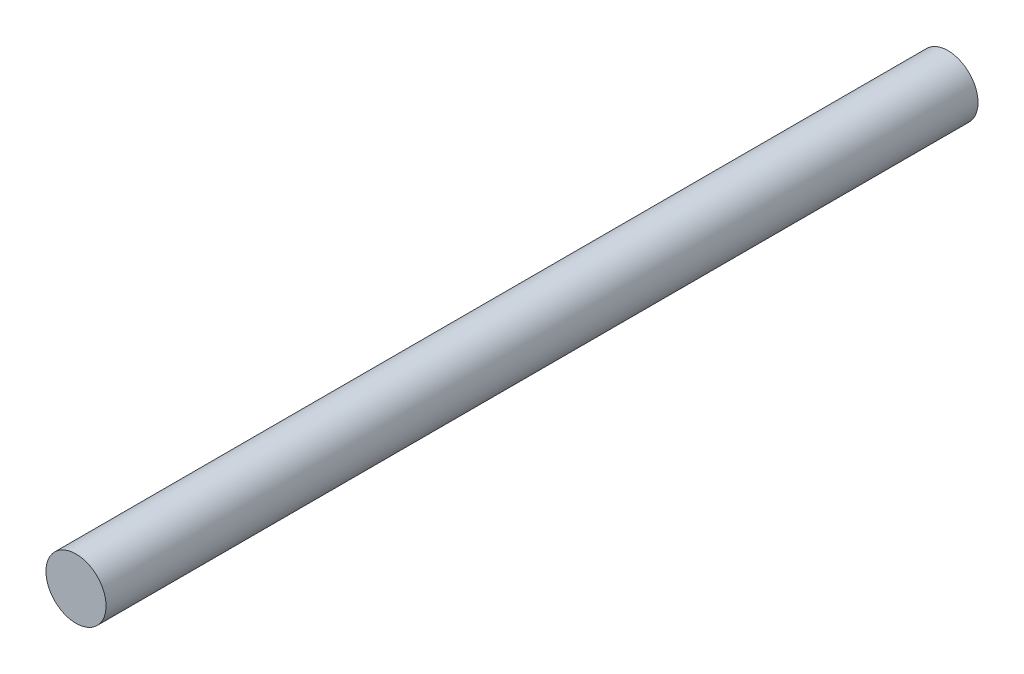
ISO-10303-21;
HEADER;
FILE_DESCRIPTION(('STEP AP214'),'2;1');
FILE_NAME('part.step','',(''),(''),'','','');
FILE_SCHEMA(('AUTOMOTIVE_DESIGN { 1 0 10303 214 1 1 1 1 }'));
ENDSEC;
DATA;
#1=APPLICATION_CONTEXT('core data for automotive mechanical design processes');
#2=APPLICATION_PROTOCOL_DEFINITION('international standard','automotive_design',2000,#1);
#3=PRODUCT_CONTEXT('',#1,'mechanical');
#4=PRODUCT('Part','Part','',(#3));
#5=PRODUCT_RELATED_PRODUCT_CATEGORY('part','',(#4));
#6=PRODUCT_DEFINITION_FORMATION('','',#4);
#7=PRODUCT_DEFINITION_CONTEXT('part definition',#1,'design');
#8=PRODUCT_DEFINITION('design','',#6,#7);
#9=PRODUCT_DEFINITION_SHAPE('','',#8);
#10=(LENGTH_UNIT() NAMED_UNIT(*) SI_UNIT(.MILLI.,.METRE.));
#11=(NAMED_UNIT(*) PLANE_ANGLE_UNIT() SI_UNIT($,.RADIAN.));
#12=(NAMED_UNIT(*) SI_UNIT($,.STERADIAN.) SOLID_ANGLE_UNIT());
#13=UNCERTAINTY_MEASURE_WITH_UNIT(LENGTH_MEASURE(1.E-05),#10,'distance_accuracy_value','');
#14=(GEOMETRIC_REPRESENTATION_CONTEXT(3) GLOBAL_UNCERTAINTY_ASSIGNED_CONTEXT((#13)) GLOBAL_UNIT_ASSIGNED_CONTEXT((#10,
#11,#12)) REPRESENTATION_CONTEXT('',''));
#15=CARTESIAN_POINT('',(0.,0.,0.));
#16=DIRECTION('',(0.,0.,1.));
#17=DIRECTION('',(1.,0.,0.));
#18=AXIS2_PLACEMENT_3D('',#15,#16,#17);
#19=CARTESIAN_POINT('',(0.,0.,72.5));
#20=DIRECTION('',(0.,0.,-1.));
#21=DIRECTION('',(-1.,0.,0.));
#22=AXIS2_PLACEMENT_3D('',#19,#20,#21);
#23=CYLINDRICAL_SURFACE('',#22,5.);
#24=CARTESIAN_POINT('',(0.,0.,72.5));
#25=DIRECTION('',(0.,0.,1.));
#26=DIRECTION('',(1.,0.,0.));
#27=AXIS2_PLACEMENT_3D('',#24,#25,#26);
#28=CIRCLE('',#27,5.);
#29=CARTESIAN_POINT('',(5.,0.,72.5));
#30=VERTEX_POINT('',#29);
#31=EDGE_CURVE('E10',#30,#30,#28,.T.);
#32=ORIENTED_EDGE('',*,*,#31,.F.);
#33=EDGE_LOOP('',(#32));
#34=FACE_BOUND('',#33,.T.);
#35=CARTESIAN_POINT('',(0.,0.,-72.5));
#36=DIRECTION('',(0.,0.,1.));
#37=DIRECTION('',(1.,0.,0.));
#38=AXIS2_PLACEMENT_3D('',#35,#36,#37);
#39=CIRCLE('',#38,5.);
#40=CARTESIAN_POINT('',(5.,0.,-72.5));
#41=VERTEX_POINT('',#40);
#42=EDGE_CURVE('E34',#41,#41,#39,.T.);
#43=ORIENTED_EDGE('',*,*,#42,.T.);
#44=EDGE_LOOP('',(#43));
#45=FACE_BOUND('',#44,.T.);
#46=ADVANCED_FACE('F31',(#34,#45),#23,.T.);
#47=CARTESIAN_POINT('',(0.,0.,72.5));
#48=DIRECTION('',(0.,0.,1.));
#49=DIRECTION('',(1.,0.,0.));
#50=AXIS2_PLACEMENT_3D('',#47,#48,#49);
#51=PLANE('',#50);
#52=ORIENTED_EDGE('',*,*,#31,.T.);
#53=EDGE_LOOP('',(#52));
#54=FACE_BOUND('',#53,.T.);
#55=ADVANCED_FACE('F46',(#54),#51,.T.);
#56=CARTESIAN_POINT('',(0.,0.,-72.5));
#57=DIRECTION('',(0.,0.,1.));
#58=DIRECTION('',(1.,0.,0.));
#59=AXIS2_PLACEMENT_3D('',#56,#57,#58);
#60=PLANE('',#59);
#61=ORIENTED_EDGE('',*,*,#42,.F.);
#62=EDGE_LOOP('',(#61));
#63=FACE_BOUND('',#62,.T.);
#64=ADVANCED_FACE('F44',(#63),#60,.F.);
#65=CLOSED_SHELL('',(#46,#55,#64));
#66=MANIFOLD_SOLID_BREP('B2',#65);
#67=ADVANCED_BREP_SHAPE_REPRESENTATION('',(#18,#66),#14);
#68=SHAPE_DEFINITION_REPRESENTATION(#9,#67);
ENDSEC;
END-ISO-10303-21;
